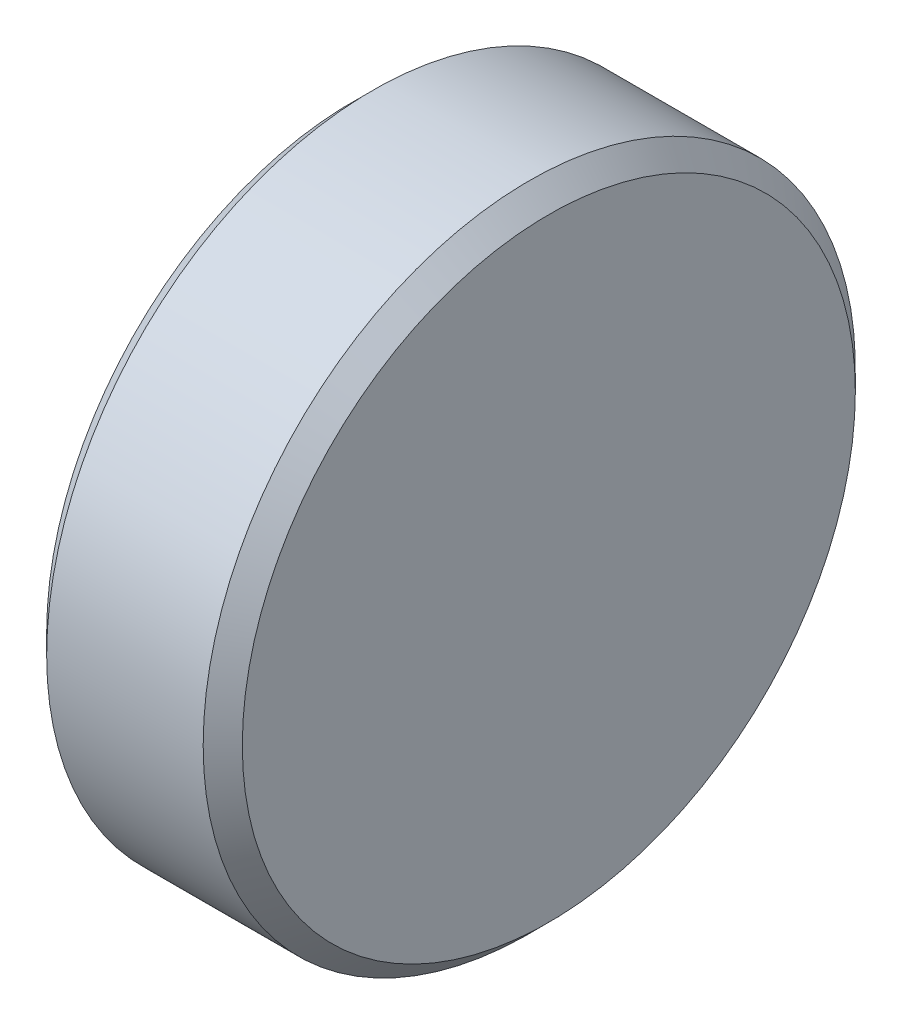
ISO-10303-21;
HEADER;
FILE_DESCRIPTION(('STEP AP214'),'2;1');
FILE_NAME('part.step','',(''),(''),'','','');
FILE_SCHEMA(('AUTOMOTIVE_DESIGN { 1 0 10303 214 1 1 1 1 }'));
ENDSEC;
DATA;
#1=APPLICATION_CONTEXT('core data for automotive mechanical design processes');
#2=APPLICATION_PROTOCOL_DEFINITION('international standard','automotive_design',2000,#1);
#3=PRODUCT_CONTEXT('',#1,'mechanical');
#4=PRODUCT('Part','Part','',(#3));
#5=PRODUCT_RELATED_PRODUCT_CATEGORY('part','',(#4));
#6=PRODUCT_DEFINITION_FORMATION('','',#4);
#7=PRODUCT_DEFINITION_CONTEXT('part definition',#1,'design');
#8=PRODUCT_DEFINITION('design','',#6,#7);
#9=PRODUCT_DEFINITION_SHAPE('','',#8);
#10=(LENGTH_UNIT() NAMED_UNIT(*) SI_UNIT(.MILLI.,.METRE.));
#11=(NAMED_UNIT(*) PLANE_ANGLE_UNIT() SI_UNIT($,.RADIAN.));
#12=(NAMED_UNIT(*) SI_UNIT($,.STERADIAN.) SOLID_ANGLE_UNIT());
#13=UNCERTAINTY_MEASURE_WITH_UNIT(LENGTH_MEASURE(1.E-05),#10,'distance_accuracy_value','');
#14=(GEOMETRIC_REPRESENTATION_CONTEXT(3) GLOBAL_UNCERTAINTY_ASSIGNED_CONTEXT((#13)) GLOBAL_UNIT_ASSIGNED_CONTEXT((#10,
#11,#12)) REPRESENTATION_CONTEXT('',''));
#15=CARTESIAN_POINT('',(0.,0.,0.));
#16=DIRECTION('',(0.,0.,1.));
#17=DIRECTION('',(1.,0.,0.));
#18=AXIS2_PLACEMENT_3D('',#15,#16,#17);
#19=CARTESIAN_POINT('',(19.05,0.,0.));
#20=DIRECTION('',(-1.,0.,0.));
#21=DIRECTION('',(0.,0.,1.));
#22=AXIS2_PLACEMENT_3D('',#19,#20,#21);
#23=CYLINDRICAL_SURFACE('',#22,31.75);
#24=CARTESIAN_POINT('',(17.1450000000001,0.,0.));
#25=DIRECTION('',(1.,0.,0.));
#26=DIRECTION('',(0.,0.,-1.));
#27=AXIS2_PLACEMENT_3D('',#24,#25,#26);
#28=CIRCLE('',#27,31.75);
#29=CARTESIAN_POINT('',(17.1450000000001,0.,31.75));
#30=VERTEX_POINT('',#29);
#31=EDGE_CURVE('E54',#30,#30,#28,.F.);
#32=CARTESIAN_POINT('',(1.90500000000005,0.,0.));
#33=DIRECTION('',(1.,0.,0.));
#34=DIRECTION('',(0.,0.,-1.));
#35=AXIS2_PLACEMENT_3D('',#32,#33,#34);
#36=CIRCLE('',#35,31.75);
#37=CARTESIAN_POINT('',(1.90500000000005,0.,31.75));
#38=VERTEX_POINT('',#37);
#39=EDGE_CURVE('E59',#38,#38,#36,.T.);
#40=CARTESIAN_POINT('',(17.1450000000001,0.,31.75));
#41=CARTESIAN_POINT('',(16.9862500000001,0.,31.75));
#42=CARTESIAN_POINT('',(16.8275000000001,0.,31.75));
#43=CARTESIAN_POINT('',(16.5100000000001,0.,31.75));
#44=CARTESIAN_POINT('',(16.3512500000001,0.,31.75));
#45=CARTESIAN_POINT('',(16.0337500000001,0.,31.75));
#46=CARTESIAN_POINT('',(15.8750000000001,0.,31.75));
#47=CARTESIAN_POINT('',(15.5575000000001,0.,31.75));
#48=CARTESIAN_POINT('',(15.3987500000001,0.,31.75));
#49=CARTESIAN_POINT('',(15.0812500000001,0.,31.75));
#50=CARTESIAN_POINT('',(14.9225000000001,0.,31.75));
#51=CARTESIAN_POINT('',(14.6050000000001,0.,31.75));
#52=CARTESIAN_POINT('',(14.4462500000001,0.,31.75));
#53=CARTESIAN_POINT('',(14.1287500000001,0.,31.75));
#54=CARTESIAN_POINT('',(13.9700000000001,0.,31.75));
#55=CARTESIAN_POINT('',(13.6525000000001,0.,31.75));
#56=CARTESIAN_POINT('',(13.4937500000001,0.,31.75));
#57=CARTESIAN_POINT('',(13.1762500000001,0.,31.75));
#58=CARTESIAN_POINT('',(13.0175000000001,0.,31.75));
#59=CARTESIAN_POINT('',(12.7000000000001,0.,31.75));
#60=CARTESIAN_POINT('',(12.5412500000001,0.,31.75));
#61=CARTESIAN_POINT('',(12.2237500000001,0.,31.75));
#62=CARTESIAN_POINT('',(12.0650000000001,0.,31.75));
#63=CARTESIAN_POINT('',(11.7475000000001,0.,31.75));
#64=CARTESIAN_POINT('',(11.5887500000001,0.,31.75));
#65=CARTESIAN_POINT('',(11.2712500000001,0.,31.75));
#66=CARTESIAN_POINT('',(11.1125000000001,0.,31.75));
#67=CARTESIAN_POINT('',(10.7950000000001,0.,31.75));
#68=CARTESIAN_POINT('',(10.6362500000001,0.,31.75));
#69=CARTESIAN_POINT('',(10.3187500000001,0.,31.75));
#70=CARTESIAN_POINT('',(10.1600000000001,0.,31.75));
#71=CARTESIAN_POINT('',(9.84250000000006,0.,31.75));
#72=CARTESIAN_POINT('',(9.68375000000006,0.,31.75));
#73=CARTESIAN_POINT('',(9.36625000000006,0.,31.75));
#74=CARTESIAN_POINT('',(9.20750000000006,0.,31.75));
#75=CARTESIAN_POINT('',(8.89000000000006,0.,31.75));
#76=CARTESIAN_POINT('',(8.73125000000006,0.,31.75));
#77=CARTESIAN_POINT('',(8.41375000000006,0.,31.75));
#78=CARTESIAN_POINT('',(8.25500000000006,0.,31.75));
#79=CARTESIAN_POINT('',(7.93750000000006,0.,31.75));
#80=CARTESIAN_POINT('',(7.77875000000006,0.,31.75));
#81=CARTESIAN_POINT('',(7.46125000000006,0.,31.75));
#82=CARTESIAN_POINT('',(7.30250000000006,0.,31.75));
#83=CARTESIAN_POINT('',(6.98500000000006,0.,31.75));
#84=CARTESIAN_POINT('',(6.82625000000005,0.,31.75));
#85=CARTESIAN_POINT('',(6.50875000000006,0.,31.75));
#86=CARTESIAN_POINT('',(6.35000000000005,0.,31.75));
#87=CARTESIAN_POINT('',(6.03250000000005,0.,31.75));
#88=CARTESIAN_POINT('',(5.87375000000006,0.,31.75));
#89=CARTESIAN_POINT('',(5.55625000000006,0.,31.75));
#90=CARTESIAN_POINT('',(5.39750000000005,0.,31.75));
#91=CARTESIAN_POINT('',(5.08000000000005,0.,31.75));
#92=CARTESIAN_POINT('',(4.92125000000005,0.,31.75));
#93=CARTESIAN_POINT('',(4.60375000000005,0.,31.75));
#94=CARTESIAN_POINT('',(4.44500000000005,0.,31.75));
#95=CARTESIAN_POINT('',(4.12750000000005,0.,31.75));
#96=CARTESIAN_POINT('',(3.96875000000005,0.,31.75));
#97=CARTESIAN_POINT('',(3.65125000000005,0.,31.75));
#98=CARTESIAN_POINT('',(3.49250000000005,0.,31.75));
#99=CARTESIAN_POINT('',(3.17500000000005,0.,31.75));
#100=CARTESIAN_POINT('',(3.01625000000005,0.,31.75));
#101=CARTESIAN_POINT('',(2.69875000000005,0.,31.75));
#102=CARTESIAN_POINT('',(2.54000000000005,0.,31.75));
#103=CARTESIAN_POINT('',(2.22250000000005,0.,31.75));
#104=CARTESIAN_POINT('',(2.06375000000005,0.,31.75));
#105=CARTESIAN_POINT('',(1.90500000000005,0.,31.75));
#106=B_SPLINE_CURVE_WITH_KNOTS('',3,(#40,#41,#42,#43,#44,#45,#46,#47,#48,#49,#50,#51,#52,#53,
#54,#55,#56,#57,#58,#59,#60,#61,#62,#63,#64,#65,#66,#67,#68,#69,#70,#71,#72,#73,#74,#75,#76,#77,
#78,#79,#80,#81,#82,#83,#84,#85,#86,#87,#88,#89,#90,#91,#92,#93,#94,#95,#96,#97,#98,#99,#100,
#101,#102,#103,#104,#105),.UNSPECIFIED.,.F.,.F.,(4,2,2,2,2,2,2,2,2,2,2,2,2,2,2,2,2,2,2,2,2,2,2,
2,2,2,2,2,2,2,2,2,4),(0.,0.476250000000001,0.952500000000002,1.42875,1.905,2.38125,2.8575,
3.33375,3.81,4.28625000000001,4.76250000000001,5.23875000000001,5.71500000000001,
6.19125000000001,6.66750000000001,7.14375000000001,7.62000000000001,8.09625000000001,
8.57250000000001,9.04875000000001,9.52500000000001,10.00125,10.4775,10.95375,11.43,11.90625,
12.3825,12.85875,13.335,13.81125,14.2875,14.76375,15.24),.UNSPECIFIED.);
#107=EDGE_CURVE('BSEAM45',#30,#38,#106,.T.);
#108=ORIENTED_EDGE('',*,*,#31,.T.);
#109=ORIENTED_EDGE('',*,*,#39,.T.);
#110=ORIENTED_EDGE('',*,*,#107,.T.);
#111=ORIENTED_EDGE('',*,*,#107,.F.);
#112=EDGE_LOOP('',(#108,#110,#109,#111));
#113=FACE_BOUND('',#112,.T.);
#114=ADVANCED_FACE('F45',(#113),#23,.T.);
#115=CARTESIAN_POINT('',(19.05,0.,0.));
#116=DIRECTION('',(1.,0.,0.));
#117=DIRECTION('',(0.,0.,-1.));
#118=AXIS2_PLACEMENT_3D('',#115,#116,#117);
#119=PLANE('',#118);
#120=CARTESIAN_POINT('',(19.05,0.,0.));
#121=DIRECTION('',(1.,0.,0.));
#122=DIRECTION('',(0.,0.,-1.));
#123=AXIS2_PLACEMENT_3D('',#120,#121,#122);
#124=CIRCLE('',#123,29.8450000000001);
#125=CARTESIAN_POINT('',(19.05,0.,-29.8450000000001));
#126=VERTEX_POINT('',#125);
#127=EDGE_CURVE('E64',#126,#126,#124,.T.);
#128=ORIENTED_EDGE('',*,*,#127,.T.);
#129=EDGE_LOOP('',(#128));
#130=FACE_BOUND('',#129,.T.);
#131=ADVANCED_FACE('F89',(#130),#119,.T.);
#132=CARTESIAN_POINT('',(0.,0.,0.));
#133=DIRECTION('',(1.,0.,0.));
#134=DIRECTION('',(0.,0.,-1.));
#135=AXIS2_PLACEMENT_3D('',#132,#133,#134);
#136=PLANE('',#135);
#137=CARTESIAN_POINT('',(0.,0.,0.));
#138=DIRECTION('',(1.,0.,0.));
#139=DIRECTION('',(0.,0.,-1.));
#140=AXIS2_PLACEMENT_3D('',#137,#138,#139);
#141=CIRCLE('',#140,29.8449999999999);
#142=CARTESIAN_POINT('',(0.,0.,-29.8449999999999));
#143=VERTEX_POINT('',#142);
#144=EDGE_CURVE('E10',#143,#143,#141,.F.);
#145=ORIENTED_EDGE('',*,*,#144,.T.);
#146=EDGE_LOOP('',(#145));
#147=FACE_BOUND('',#146,.T.);
#148=CARTESIAN_POINT('',(0.,0.,0.));
#149=DIRECTION('',(-1.,0.,0.));
#150=DIRECTION('',(0.,0.,1.));
#151=AXIS2_PLACEMENT_3D('',#148,#149,#150);
#152=CIRCLE('',#151,2.9845);
#153=CARTESIAN_POINT('',(0.,0.,2.9845));
#154=VERTEX_POINT('',#153);
#155=EDGE_CURVE('E71',#154,#154,#152,.T.);
#156=ORIENTED_EDGE('',*,*,#155,.F.);
#157=EDGE_LOOP('',(#156));
#158=FACE_BOUND('',#157,.T.);
#159=ADVANCED_FACE('F84',(#147,#158),#136,.F.);
#160=CARTESIAN_POINT('',(12.7,0.,0.));
#161=DIRECTION('',(-1.,0.,0.));
#162=DIRECTION('',(0.,0.,1.));
#163=AXIS2_PLACEMENT_3D('',#160,#161,#162);
#164=CYLINDRICAL_SURFACE('',#163,2.9845);
#165=CARTESIAN_POINT('',(12.7,0.,0.));
#166=DIRECTION('',(-1.,0.,0.));
#167=DIRECTION('',(0.,0.,1.));
#168=AXIS2_PLACEMENT_3D('',#165,#166,#167);
#169=CIRCLE('',#168,2.9845);
#170=CARTESIAN_POINT('',(12.7,0.,2.9845));
#171=VERTEX_POINT('',#170);
#172=EDGE_CURVE('E70',#171,#171,#169,.T.);
#173=ORIENTED_EDGE('',*,*,#172,.F.);
#174=EDGE_LOOP('',(#173));
#175=FACE_BOUND('',#174,.T.);
#176=ORIENTED_EDGE('',*,*,#155,.T.);
#177=EDGE_LOOP('',(#176));
#178=FACE_BOUND('',#177,.T.);
#179=ADVANCED_FACE('F81',(#175,#178),#164,.F.);
#180=CARTESIAN_POINT('',(12.7,0.,0.));
#181=DIRECTION('',(-1.,0.,0.));
#182=DIRECTION('',(0.,0.,1.));
#183=AXIS2_PLACEMENT_3D('',#180,#181,#182);
#184=PLANE('',#183);
#185=ORIENTED_EDGE('',*,*,#172,.T.);
#186=EDGE_LOOP('',(#185));
#187=FACE_BOUND('',#186,.T.);
#188=ADVANCED_FACE('F79',(#187),#184,.T.);
#189=CARTESIAN_POINT('',(19.05,0.,0.));
#190=DIRECTION('',(-1.,0.,0.));
#191=DIRECTION('',(0.,0.,1.));
#192=AXIS2_PLACEMENT_3D('',#189,#190,#191);
#193=CONICAL_SURFACE('',#192,29.8450000000001,0.78539816339745);
#194=ORIENTED_EDGE('',*,*,#31,.F.);
#195=EDGE_LOOP('',(#194));
#196=FACE_BOUND('',#195,.T.);
#197=ORIENTED_EDGE('',*,*,#127,.F.);
#198=EDGE_LOOP('',(#197));
#199=FACE_BOUND('',#198,.T.);
#200=ADVANCED_FACE('F104',(#196,#199),#193,.T.);
#201=CARTESIAN_POINT('',(1.90500000000005,0.,0.));
#202=DIRECTION('',(1.,0.,0.));
#203=DIRECTION('',(0.,0.,-1.));
#204=AXIS2_PLACEMENT_3D('',#201,#202,#203);
#205=CONICAL_SURFACE('',#204,31.75,0.785398163397448);
#206=ORIENTED_EDGE('',*,*,#144,.F.);
#207=EDGE_LOOP('',(#206));
#208=FACE_BOUND('',#207,.T.);
#209=ORIENTED_EDGE('',*,*,#39,.F.);
#210=EDGE_LOOP('',(#209));
#211=FACE_BOUND('',#210,.T.);
#212=ADVANCED_FACE('F48',(#208,#211),#205,.T.);
#213=CLOSED_SHELL('',(#114,#131,#159,#179,#188,#200,#212));
#214=MANIFOLD_SOLID_BREP('B2',#213);
#215=ADVANCED_BREP_SHAPE_REPRESENTATION('',(#18,#214),#14);
#216=SHAPE_DEFINITION_REPRESENTATION(#9,#215);
ENDSEC;
END-ISO-10303-21;
